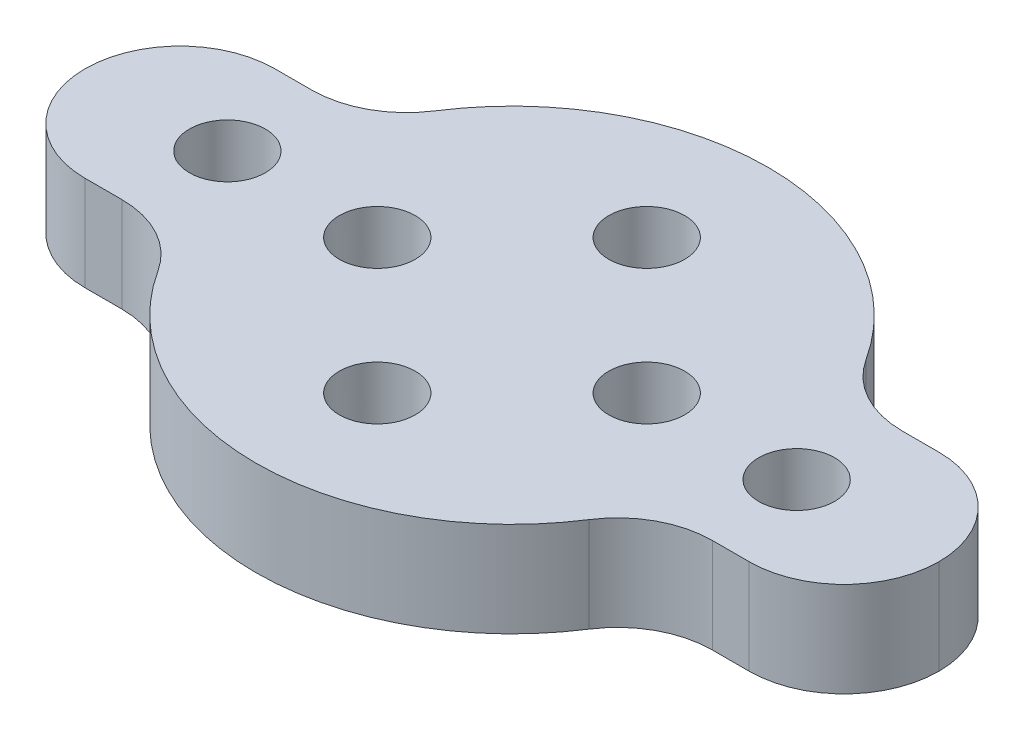
ISO-10303-21;
HEADER;
FILE_DESCRIPTION(('STEP AP214'),'2;1');
FILE_NAME('part.step','',(''),(''),'','','');
FILE_SCHEMA(('AUTOMOTIVE_DESIGN { 1 0 10303 214 1 1 1 1 }'));
ENDSEC;
DATA;
#1=APPLICATION_CONTEXT('core data for automotive mechanical design processes');
#2=APPLICATION_PROTOCOL_DEFINITION('international standard','automotive_design',2000,#1);
#3=PRODUCT_CONTEXT('',#1,'mechanical');
#4=PRODUCT('Part','Part','',(#3));
#5=PRODUCT_RELATED_PRODUCT_CATEGORY('part','',(#4));
#6=PRODUCT_DEFINITION_FORMATION('','',#4);
#7=PRODUCT_DEFINITION_CONTEXT('part definition',#1,'design');
#8=PRODUCT_DEFINITION('design','',#6,#7);
#9=PRODUCT_DEFINITION_SHAPE('','',#8);
#10=(LENGTH_UNIT() NAMED_UNIT(*) SI_UNIT(.MILLI.,.METRE.));
#11=(NAMED_UNIT(*) PLANE_ANGLE_UNIT() SI_UNIT($,.RADIAN.));
#12=(NAMED_UNIT(*) SI_UNIT($,.STERADIAN.) SOLID_ANGLE_UNIT());
#13=UNCERTAINTY_MEASURE_WITH_UNIT(LENGTH_MEASURE(1.E-05),#10,'distance_accuracy_value','');
#14=(GEOMETRIC_REPRESENTATION_CONTEXT(3) GLOBAL_UNCERTAINTY_ASSIGNED_CONTEXT((#13)) GLOBAL_UNIT_ASSIGNED_CONTEXT((#10,
#11,#12)) REPRESENTATION_CONTEXT('',''));
#15=CARTESIAN_POINT('',(0.,0.,0.));
#16=DIRECTION('',(0.,0.,1.));
#17=DIRECTION('',(1.,0.,0.));
#18=AXIS2_PLACEMENT_3D('',#15,#16,#17);
#19=CARTESIAN_POINT('',(0.,5.,-7.10000000000007));
#20=DIRECTION('',(0.,-1.,0.));
#21=DIRECTION('',(0.,0.,-1.));
#22=AXIS2_PLACEMENT_3D('',#19,#20,#21);
#23=CYLINDRICAL_SURFACE('',#22,1.99999999999993);
#24=CARTESIAN_POINT('',(0.,5.,-7.10000000000007));
#25=DIRECTION('',(0.,1.,0.));
#26=DIRECTION('',(0.,0.,1.));
#27=AXIS2_PLACEMENT_3D('',#24,#25,#26);
#28=CIRCLE('',#27,1.99999999999993);
#29=CARTESIAN_POINT('',(0.,5.,-5.10000000000015));
#30=VERTEX_POINT('',#29);
#31=EDGE_CURVE('E287',#30,#30,#28,.T.);
#32=ORIENTED_EDGE('',*,*,#31,.T.);
#33=EDGE_LOOP('',(#32));
#34=FACE_BOUND('',#33,.T.);
#35=CARTESIAN_POINT('',(0.,2.,-7.10000000000007));
#36=DIRECTION('',(0.,-1.,0.));
#37=DIRECTION('',(0.,0.,-1.));
#38=AXIS2_PLACEMENT_3D('',#35,#36,#37);
#39=CIRCLE('',#38,1.99999999999993);
#40=CARTESIAN_POINT('',(0.,2.,-9.1));
#41=VERTEX_POINT('',#40);
#42=EDGE_CURVE('E38',#41,#41,#39,.T.);
#43=ORIENTED_EDGE('',*,*,#42,.T.);
#44=EDGE_LOOP('',(#43));
#45=FACE_BOUND('',#44,.T.);
#46=ADVANCED_FACE('F34',(#34,#45),#23,.F.);
#47=CARTESIAN_POINT('',(0.,5.,7.09999999999993));
#48=DIRECTION('',(0.,-1.,0.));
#49=DIRECTION('',(0.,0.,-1.));
#50=AXIS2_PLACEMENT_3D('',#47,#48,#49);
#51=CYLINDRICAL_SURFACE('',#50,2.00000000000008);
#52=CARTESIAN_POINT('',(0.,5.,7.09999999999993));
#53=DIRECTION('',(0.,1.,0.));
#54=DIRECTION('',(0.,0.,1.));
#55=AXIS2_PLACEMENT_3D('',#52,#53,#54);
#56=CIRCLE('',#55,2.00000000000008);
#57=CARTESIAN_POINT('',(0.,5.,9.10000000000001));
#58=VERTEX_POINT('',#57);
#59=EDGE_CURVE('E290',#58,#58,#56,.T.);
#60=ORIENTED_EDGE('',*,*,#59,.T.);
#61=EDGE_LOOP('',(#60));
#62=FACE_BOUND('',#61,.T.);
#63=CARTESIAN_POINT('',(0.,2.,7.09999999999993));
#64=DIRECTION('',(0.,-1.,0.));
#65=DIRECTION('',(0.,0.,-1.));
#66=AXIS2_PLACEMENT_3D('',#63,#64,#65);
#67=CIRCLE('',#66,2.00000000000008);
#68=CARTESIAN_POINT('',(0.,2.,5.09999999999984));
#69=VERTEX_POINT('',#68);
#70=EDGE_CURVE('E230',#69,#69,#67,.T.);
#71=ORIENTED_EDGE('',*,*,#70,.T.);
#72=EDGE_LOOP('',(#71));
#73=FACE_BOUND('',#72,.T.);
#74=ADVANCED_FACE('F339',(#62,#73),#51,.F.);
#75=CARTESIAN_POINT('',(-7.1,5.,0.));
#76=DIRECTION('',(0.,-1.,0.));
#77=DIRECTION('',(0.,0.,-1.));
#78=AXIS2_PLACEMENT_3D('',#75,#76,#77);
#79=CYLINDRICAL_SURFACE('',#78,2.);
#80=CARTESIAN_POINT('',(-7.1,5.,0.));
#81=DIRECTION('',(0.,1.,0.));
#82=DIRECTION('',(0.,0.,1.));
#83=AXIS2_PLACEMENT_3D('',#80,#81,#82);
#84=CIRCLE('',#83,2.);
#85=CARTESIAN_POINT('',(-7.1,5.,2.));
#86=VERTEX_POINT('',#85);
#87=EDGE_CURVE('E271',#86,#86,#84,.T.);
#88=ORIENTED_EDGE('',*,*,#87,.T.);
#89=EDGE_LOOP('',(#88));
#90=FACE_BOUND('',#89,.T.);
#91=CARTESIAN_POINT('',(-7.1,2.,0.));
#92=DIRECTION('',(0.,-1.,0.));
#93=DIRECTION('',(0.,0.,-1.));
#94=AXIS2_PLACEMENT_3D('',#91,#92,#93);
#95=CIRCLE('',#94,2.);
#96=CARTESIAN_POINT('',(-7.1,2.,-2.));
#97=VERTEX_POINT('',#96);
#98=EDGE_CURVE('E194',#97,#97,#95,.T.);
#99=ORIENTED_EDGE('',*,*,#98,.T.);
#100=EDGE_LOOP('',(#99));
#101=FACE_BOUND('',#100,.T.);
#102=ADVANCED_FACE('F345',(#90,#101),#79,.F.);
#103=CARTESIAN_POINT('',(7.1,5.,0.));
#104=DIRECTION('',(0.,-1.,0.));
#105=DIRECTION('',(0.,0.,-1.));
#106=AXIS2_PLACEMENT_3D('',#103,#104,#105);
#107=CYLINDRICAL_SURFACE('',#106,2.);
#108=CARTESIAN_POINT('',(7.1,5.,0.));
#109=DIRECTION('',(0.,1.,0.));
#110=DIRECTION('',(0.,0.,1.));
#111=AXIS2_PLACEMENT_3D('',#108,#109,#110);
#112=CIRCLE('',#111,2.);
#113=CARTESIAN_POINT('',(7.1,5.,2.));
#114=VERTEX_POINT('',#113);
#115=EDGE_CURVE('E268',#114,#114,#112,.T.);
#116=ORIENTED_EDGE('',*,*,#115,.T.);
#117=EDGE_LOOP('',(#116));
#118=FACE_BOUND('',#117,.T.);
#119=CARTESIAN_POINT('',(7.1,2.,0.));
#120=DIRECTION('',(0.,-1.,0.));
#121=DIRECTION('',(0.,0.,-1.));
#122=AXIS2_PLACEMENT_3D('',#119,#120,#121);
#123=CIRCLE('',#122,2.);
#124=CARTESIAN_POINT('',(7.1,2.,-2.));
#125=VERTEX_POINT('',#124);
#126=EDGE_CURVE('E225',#125,#125,#123,.T.);
#127=ORIENTED_EDGE('',*,*,#126,.T.);
#128=EDGE_LOOP('',(#127));
#129=FACE_BOUND('',#128,.T.);
#130=ADVANCED_FACE('F370',(#118,#129),#107,.F.);
#131=CARTESIAN_POINT('',(0.,5.,5.));
#132=DIRECTION('',(0.,0.,-1.));
#133=DIRECTION('',(-1.,0.,0.));
#134=AXIS2_PLACEMENT_3D('',#131,#132,#133);
#135=PLANE('',#134);
#136=DIRECTION('',(1.,0.,0.));
#137=VECTOR('',#136,1.);
#138=CARTESIAN_POINT('',(0.,0.,5.));
#139=LINE('',#138,#137);
#140=CARTESIAN_POINT('',(-17.5,0.,5.));
#141=VERTEX_POINT('',#140);
#142=CARTESIAN_POINT('',(-15.5643824162734,0.,5.));
#143=VERTEX_POINT('',#142);
#144=EDGE_CURVE('E140',#141,#143,#139,.T.);
#145=ORIENTED_EDGE('',*,*,#144,.T.);
#146=DIRECTION('',(0.,1.,0.));
#147=VECTOR('',#146,1.);
#148=CARTESIAN_POINT('',(-15.5643824162734,5.,5.));
#149=LINE('',#148,#147);
#150=CARTESIAN_POINT('',(-15.5643824162734,5.,5.));
#151=VERTEX_POINT('',#150);
#152=EDGE_CURVE('E209',#143,#151,#149,.T.);
#153=ORIENTED_EDGE('',*,*,#152,.T.);
#154=DIRECTION('',(1.,0.,0.));
#155=VECTOR('',#154,1.);
#156=CARTESIAN_POINT('',(0.,5.,5.));
#157=LINE('',#156,#155);
#158=CARTESIAN_POINT('',(-17.5,5.,5.));
#159=VERTEX_POINT('',#158);
#160=EDGE_CURVE('E143',#159,#151,#157,.T.);
#161=ORIENTED_EDGE('',*,*,#160,.F.);
#162=DIRECTION('',(0.,-1.,0.));
#163=VECTOR('',#162,1.);
#164=CARTESIAN_POINT('',(-17.5,0.,5.));
#165=LINE('',#164,#163);
#166=EDGE_CURVE('E137',#159,#141,#165,.T.);
#167=ORIENTED_EDGE('',*,*,#166,.T.);
#168=EDGE_LOOP('',(#145,#153,#161,#167));
#169=FACE_BOUND('',#168,.T.);
#170=ADVANCED_FACE('F139',(#169),#135,.F.);
#171=CARTESIAN_POINT('',(0.,5.,0.));
#172=DIRECTION('',(0.,-1.,0.));
#173=DIRECTION('',(0.,0.,-1.));
#174=AXIS2_PLACEMENT_3D('',#171,#172,#173);
#175=CYLINDRICAL_SURFACE('',#174,13.5);
#176=CARTESIAN_POINT('',(0.,5.,0.));
#177=DIRECTION('',(0.,1.,0.));
#178=DIRECTION('',(0.,0.,1.));
#179=AXIS2_PLACEMENT_3D('',#176,#177,#178);
#180=CIRCLE('',#179,13.5);
#181=CARTESIAN_POINT('',(-11.3577925740373,5.,7.2972972972973));
#182=VERTEX_POINT('',#181);
#183=CARTESIAN_POINT('',(11.3577925740373,5.,7.2972972972973));
#184=VERTEX_POINT('',#183);
#185=EDGE_CURVE('E275',#182,#184,#180,.T.);
#186=ORIENTED_EDGE('',*,*,#185,.F.);
#187=DIRECTION('',(0.,-1.,0.));
#188=VECTOR('',#187,1.);
#189=CARTESIAN_POINT('',(-11.3577925740373,5.,7.2972972972973));
#190=LINE('',#189,#188);
#191=CARTESIAN_POINT('',(-11.3577925740373,0.,7.2972972972973));
#192=VERTEX_POINT('',#191);
#193=EDGE_CURVE('E206',#182,#192,#190,.T.);
#194=ORIENTED_EDGE('',*,*,#193,.T.);
#195=CARTESIAN_POINT('',(0.,0.,0.));
#196=DIRECTION('',(0.,1.,0.));
#197=DIRECTION('',(0.,0.,1.));
#198=AXIS2_PLACEMENT_3D('',#195,#196,#197);
#199=CIRCLE('',#198,13.5);
#200=CARTESIAN_POINT('',(11.3577925740373,0.,7.2972972972973));
#201=VERTEX_POINT('',#200);
#202=EDGE_CURVE('E156',#192,#201,#199,.T.);
#203=ORIENTED_EDGE('',*,*,#202,.T.);
#204=DIRECTION('',(0.,-1.,0.));
#205=VECTOR('',#204,1.);
#206=CARTESIAN_POINT('',(11.3577925740373,5.,7.2972972972973));
#207=LINE('',#206,#205);
#208=EDGE_CURVE('E204',#201,#184,#207,.F.);
#209=ORIENTED_EDGE('',*,*,#208,.T.);
#210=EDGE_LOOP('',(#186,#194,#203,#209));
#211=FACE_BOUND('',#210,.T.);
#212=ADVANCED_FACE('F324',(#211),#175,.T.);
#213=CARTESIAN_POINT('',(0.,5.,5.));
#214=DIRECTION('',(0.,0.,-1.));
#215=DIRECTION('',(-1.,0.,0.));
#216=AXIS2_PLACEMENT_3D('',#213,#214,#215);
#217=PLANE('',#216);
#218=DIRECTION('',(1.,0.,0.));
#219=VECTOR('',#218,1.);
#220=CARTESIAN_POINT('',(0.,5.,5.));
#221=LINE('',#220,#219);
#222=CARTESIAN_POINT('',(15.5643824162734,5.,5.));
#223=VERTEX_POINT('',#222);
#224=CARTESIAN_POINT('',(17.5,5.,5.));
#225=VERTEX_POINT('',#224);
#226=EDGE_CURVE('E277',#223,#225,#221,.T.);
#227=ORIENTED_EDGE('',*,*,#226,.F.);
#228=DIRECTION('',(0.,1.,0.));
#229=VECTOR('',#228,1.);
#230=CARTESIAN_POINT('',(15.5643824162734,0.,5.));
#231=LINE('',#230,#229);
#232=CARTESIAN_POINT('',(15.5643824162734,0.,5.));
#233=VERTEX_POINT('',#232);
#234=EDGE_CURVE('E211',#223,#233,#231,.F.);
#235=ORIENTED_EDGE('',*,*,#234,.T.);
#236=DIRECTION('',(1.,0.,0.));
#237=VECTOR('',#236,1.);
#238=CARTESIAN_POINT('',(0.,0.,5.));
#239=LINE('',#238,#237);
#240=CARTESIAN_POINT('',(17.5,0.,5.));
#241=VERTEX_POINT('',#240);
#242=EDGE_CURVE('E299',#233,#241,#239,.T.);
#243=ORIENTED_EDGE('',*,*,#242,.T.);
#244=DIRECTION('',(0.,-1.,0.));
#245=VECTOR('',#244,1.);
#246=CARTESIAN_POINT('',(17.5,5.,5.));
#247=LINE('',#246,#245);
#248=EDGE_CURVE('E147',#241,#225,#247,.F.);
#249=ORIENTED_EDGE('',*,*,#248,.T.);
#250=EDGE_LOOP('',(#227,#235,#243,#249));
#251=FACE_BOUND('',#250,.T.);
#252=ADVANCED_FACE('F321',(#251),#217,.F.);
#253=CARTESIAN_POINT('',(0.,5.,-5.));
#254=DIRECTION('',(0.,0.,-1.));
#255=DIRECTION('',(-1.,0.,0.));
#256=AXIS2_PLACEMENT_3D('',#253,#254,#255);
#257=PLANE('',#256);
#258=DIRECTION('',(1.,0.,0.));
#259=VECTOR('',#258,1.);
#260=CARTESIAN_POINT('',(0.,0.,-5.));
#261=LINE('',#260,#259);
#262=CARTESIAN_POINT('',(15.5643824162734,0.,-5.));
#263=VERTEX_POINT('',#262);
#264=CARTESIAN_POINT('',(17.5,0.,-5.));
#265=VERTEX_POINT('',#264);
#266=EDGE_CURVE('E301',#263,#265,#261,.T.);
#267=ORIENTED_EDGE('',*,*,#266,.F.);
#268=DIRECTION('',(0.,-1.,0.));
#269=VECTOR('',#268,1.);
#270=CARTESIAN_POINT('',(15.5643824162734,5.,-5.));
#271=LINE('',#270,#269);
#272=CARTESIAN_POINT('',(15.5643824162734,5.,-5.));
#273=VERTEX_POINT('',#272);
#274=EDGE_CURVE('E199',#263,#273,#271,.F.);
#275=ORIENTED_EDGE('',*,*,#274,.T.);
#276=DIRECTION('',(1.,0.,0.));
#277=VECTOR('',#276,1.);
#278=CARTESIAN_POINT('',(0.,5.,-5.));
#279=LINE('',#278,#277);
#280=CARTESIAN_POINT('',(17.5,5.,-5.));
#281=VERTEX_POINT('',#280);
#282=EDGE_CURVE('E279',#273,#281,#279,.T.);
#283=ORIENTED_EDGE('',*,*,#282,.T.);
#284=DIRECTION('',(0.,-1.,0.));
#285=VECTOR('',#284,1.);
#286=CARTESIAN_POINT('',(17.5,0.,-5.));
#287=LINE('',#286,#285);
#288=EDGE_CURVE('E185',#281,#265,#287,.T.);
#289=ORIENTED_EDGE('',*,*,#288,.T.);
#290=EDGE_LOOP('',(#267,#275,#283,#289));
#291=FACE_BOUND('',#290,.T.);
#292=ADVANCED_FACE('F359',(#291),#257,.T.);
#293=CARTESIAN_POINT('',(0.,5.,0.));
#294=DIRECTION('',(0.,-1.,0.));
#295=DIRECTION('',(0.,0.,-1.));
#296=AXIS2_PLACEMENT_3D('',#293,#294,#295);
#297=CYLINDRICAL_SURFACE('',#296,13.5);
#298=CARTESIAN_POINT('',(0.,5.,0.));
#299=DIRECTION('',(0.,1.,0.));
#300=DIRECTION('',(0.,0.,1.));
#301=AXIS2_PLACEMENT_3D('',#298,#299,#300);
#302=CIRCLE('',#301,13.5);
#303=CARTESIAN_POINT('',(11.3577925740373,5.,-7.2972972972973));
#304=VERTEX_POINT('',#303);
#305=CARTESIAN_POINT('',(-11.3577925740373,5.,-7.2972972972973));
#306=VERTEX_POINT('',#305);
#307=EDGE_CURVE('E281',#304,#306,#302,.T.);
#308=ORIENTED_EDGE('',*,*,#307,.F.);
#309=DIRECTION('',(0.,-1.,0.));
#310=VECTOR('',#309,1.);
#311=CARTESIAN_POINT('',(11.3577925740373,5.,-7.2972972972973));
#312=LINE('',#311,#310);
#313=CARTESIAN_POINT('',(11.3577925740373,0.,-7.2972972972973));
#314=VERTEX_POINT('',#313);
#315=EDGE_CURVE('E196',#304,#314,#312,.T.);
#316=ORIENTED_EDGE('',*,*,#315,.T.);
#317=CARTESIAN_POINT('',(0.,0.,0.));
#318=DIRECTION('',(0.,1.,0.));
#319=DIRECTION('',(0.,0.,1.));
#320=AXIS2_PLACEMENT_3D('',#317,#318,#319);
#321=CIRCLE('',#320,13.5);
#322=CARTESIAN_POINT('',(-11.3577925740373,0.,-7.2972972972973));
#323=VERTEX_POINT('',#322);
#324=EDGE_CURVE('E303',#314,#323,#321,.T.);
#325=ORIENTED_EDGE('',*,*,#324,.T.);
#326=DIRECTION('',(0.,-1.,0.));
#327=VECTOR('',#326,1.);
#328=CARTESIAN_POINT('',(-11.3577925740373,5.,-7.2972972972973));
#329=LINE('',#328,#327);
#330=EDGE_CURVE('E188',#323,#306,#329,.F.);
#331=ORIENTED_EDGE('',*,*,#330,.T.);
#332=EDGE_LOOP('',(#308,#316,#325,#331));
#333=FACE_BOUND('',#332,.T.);
#334=ADVANCED_FACE('F355',(#333),#297,.T.);
#335=CARTESIAN_POINT('',(0.,5.,-5.));
#336=DIRECTION('',(0.,0.,-1.));
#337=DIRECTION('',(-1.,0.,0.));
#338=AXIS2_PLACEMENT_3D('',#335,#336,#337);
#339=PLANE('',#338);
#340=DIRECTION('',(1.,0.,0.));
#341=VECTOR('',#340,1.);
#342=CARTESIAN_POINT('',(0.,5.,-5.));
#343=LINE('',#342,#341);
#344=CARTESIAN_POINT('',(-17.5,5.,-5.));
#345=VERTEX_POINT('',#344);
#346=CARTESIAN_POINT('',(-15.5643824162734,5.,-5.));
#347=VERTEX_POINT('',#346);
#348=EDGE_CURVE('E284',#345,#347,#343,.T.);
#349=ORIENTED_EDGE('',*,*,#348,.T.);
#350=DIRECTION('',(0.,-1.,0.));
#351=VECTOR('',#350,1.);
#352=CARTESIAN_POINT('',(-15.5643824162734,5.,-5.));
#353=LINE('',#352,#351);
#354=CARTESIAN_POINT('',(-15.5643824162734,0.,-5.));
#355=VERTEX_POINT('',#354);
#356=EDGE_CURVE('E201',#347,#355,#353,.T.);
#357=ORIENTED_EDGE('',*,*,#356,.T.);
#358=DIRECTION('',(1.,0.,0.));
#359=VECTOR('',#358,1.);
#360=CARTESIAN_POINT('',(0.,0.,-5.));
#361=LINE('',#360,#359);
#362=CARTESIAN_POINT('',(-17.5,0.,-5.));
#363=VERTEX_POINT('',#362);
#364=EDGE_CURVE('E265',#363,#355,#361,.T.);
#365=ORIENTED_EDGE('',*,*,#364,.F.);
#366=DIRECTION('',(0.,-1.,0.));
#367=VECTOR('',#366,1.);
#368=CARTESIAN_POINT('',(-17.5,5.,-5.));
#369=LINE('',#368,#367);
#370=EDGE_CURVE('E166',#363,#345,#369,.F.);
#371=ORIENTED_EDGE('',*,*,#370,.T.);
#372=EDGE_LOOP('',(#349,#357,#365,#371));
#373=FACE_BOUND('',#372,.T.);
#374=ADVANCED_FACE('F351',(#373),#339,.T.);
#375=CARTESIAN_POINT('',(-15.,5.,0.));
#376=DIRECTION('',(0.,-1.,0.));
#377=DIRECTION('',(0.,0.,-1.));
#378=AXIS2_PLACEMENT_3D('',#375,#376,#377);
#379=CYLINDRICAL_SURFACE('',#378,2.);
#380=CARTESIAN_POINT('',(-15.,5.,0.));
#381=DIRECTION('',(0.,1.,0.));
#382=DIRECTION('',(0.,0.,1.));
#383=AXIS2_PLACEMENT_3D('',#380,#381,#382);
#384=CIRCLE('',#383,2.);
#385=CARTESIAN_POINT('',(-15.,5.,2.));
#386=VERTEX_POINT('',#385);
#387=EDGE_CURVE('E264',#386,#386,#384,.T.);
#388=ORIENTED_EDGE('',*,*,#387,.T.);
#389=EDGE_LOOP('',(#388));
#390=FACE_BOUND('',#389,.T.);
#391=CARTESIAN_POINT('',(-15.,0.,0.));
#392=DIRECTION('',(0.,1.,0.));
#393=DIRECTION('',(0.,0.,1.));
#394=AXIS2_PLACEMENT_3D('',#391,#392,#393);
#395=CIRCLE('',#394,2.);
#396=CARTESIAN_POINT('',(-15.,0.,2.));
#397=VERTEX_POINT('',#396);
#398=EDGE_CURVE('E157',#397,#397,#395,.T.);
#399=ORIENTED_EDGE('',*,*,#398,.F.);
#400=EDGE_LOOP('',(#399));
#401=FACE_BOUND('',#400,.T.);
#402=ADVANCED_FACE('F354',(#390,#401),#379,.F.);
#403=CARTESIAN_POINT('',(15.,5.,0.));
#404=DIRECTION('',(0.,-1.,0.));
#405=DIRECTION('',(0.,0.,-1.));
#406=AXIS2_PLACEMENT_3D('',#403,#404,#405);
#407=CYLINDRICAL_SURFACE('',#406,2.);
#408=CARTESIAN_POINT('',(15.,5.,0.));
#409=DIRECTION('',(0.,1.,0.));
#410=DIRECTION('',(0.,0.,1.));
#411=AXIS2_PLACEMENT_3D('',#408,#409,#410);
#412=CIRCLE('',#411,2.);
#413=CARTESIAN_POINT('',(15.,5.,2.));
#414=VERTEX_POINT('',#413);
#415=EDGE_CURVE('E261',#414,#414,#412,.T.);
#416=ORIENTED_EDGE('',*,*,#415,.T.);
#417=EDGE_LOOP('',(#416));
#418=FACE_BOUND('',#417,.T.);
#419=CARTESIAN_POINT('',(15.,0.,0.));
#420=DIRECTION('',(0.,1.,0.));
#421=DIRECTION('',(0.,0.,1.));
#422=AXIS2_PLACEMENT_3D('',#419,#420,#421);
#423=CIRCLE('',#422,2.);
#424=CARTESIAN_POINT('',(15.,0.,2.));
#425=VERTEX_POINT('',#424);
#426=EDGE_CURVE('E190',#425,#425,#423,.T.);
#427=ORIENTED_EDGE('',*,*,#426,.F.);
#428=EDGE_LOOP('',(#427));
#429=FACE_BOUND('',#428,.T.);
#430=ADVANCED_FACE('F379',(#418,#429),#407,.F.);
#431=CARTESIAN_POINT('',(0.,5.,0.));
#432=DIRECTION('',(0.,1.,0.));
#433=DIRECTION('',(0.,0.,1.));
#434=AXIS2_PLACEMENT_3D('',#431,#432,#433);
#435=PLANE('',#434);
#436=ORIENTED_EDGE('',*,*,#415,.F.);
#437=EDGE_LOOP('',(#436));
#438=FACE_BOUND('',#437,.T.);
#439=ORIENTED_EDGE('',*,*,#387,.F.);
#440=EDGE_LOOP('',(#439));
#441=FACE_BOUND('',#440,.T.);
#442=ORIENTED_EDGE('',*,*,#115,.F.);
#443=EDGE_LOOP('',(#442));
#444=FACE_BOUND('',#443,.T.);
#445=ORIENTED_EDGE('',*,*,#87,.F.);
#446=EDGE_LOOP('',(#445));
#447=FACE_BOUND('',#446,.T.);
#448=ORIENTED_EDGE('',*,*,#348,.F.);
#449=CARTESIAN_POINT('',(-17.5,5.,0.));
#450=DIRECTION('',(0.,1.,0.));
#451=DIRECTION('',(0.,0.,1.));
#452=AXIS2_PLACEMENT_3D('',#449,#450,#451);
#453=CIRCLE('',#452,5.);
#454=CARTESIAN_POINT('',(-22.5,5.,0.));
#455=VERTEX_POINT('',#454);
#456=EDGE_CURVE('E148',#345,#455,#453,.T.);
#457=ORIENTED_EDGE('',*,*,#456,.T.);
#458=CARTESIAN_POINT('',(-17.5,5.,0.));
#459=DIRECTION('',(0.,1.,0.));
#460=DIRECTION('',(0.,0.,1.));
#461=AXIS2_PLACEMENT_3D('',#458,#459,#460);
#462=CIRCLE('',#461,5.);
#463=EDGE_CURVE('E180',#455,#159,#462,.T.);
#464=ORIENTED_EDGE('',*,*,#463,.T.);
#465=ORIENTED_EDGE('',*,*,#160,.T.);
#466=CARTESIAN_POINT('',(-15.5643824162734,5.,10.));
#467=DIRECTION('',(0.,1.,0.));
#468=DIRECTION('',(0.,0.,1.));
#469=AXIS2_PLACEMENT_3D('',#466,#467,#468);
#470=CIRCLE('',#469,5.);
#471=EDGE_CURVE('E222',#151,#182,#470,.F.);
#472=ORIENTED_EDGE('',*,*,#471,.T.);
#473=ORIENTED_EDGE('',*,*,#185,.T.);
#474=CARTESIAN_POINT('',(15.5643824162734,5.,10.));
#475=DIRECTION('',(0.,1.,0.));
#476=DIRECTION('',(0.,0.,1.));
#477=AXIS2_PLACEMENT_3D('',#474,#475,#476);
#478=CIRCLE('',#477,5.);
#479=EDGE_CURVE('E11',#184,#223,#478,.F.);
#480=ORIENTED_EDGE('',*,*,#479,.T.);
#481=ORIENTED_EDGE('',*,*,#226,.T.);
#482=CARTESIAN_POINT('',(17.5,5.,0.));
#483=DIRECTION('',(0.,1.,0.));
#484=DIRECTION('',(0.,0.,1.));
#485=AXIS2_PLACEMENT_3D('',#482,#483,#484);
#486=CIRCLE('',#485,5.);
#487=CARTESIAN_POINT('',(22.5,5.,0.));
#488=VERTEX_POINT('',#487);
#489=EDGE_CURVE('E178',#225,#488,#486,.T.);
#490=ORIENTED_EDGE('',*,*,#489,.T.);
#491=CARTESIAN_POINT('',(17.5,5.,0.));
#492=DIRECTION('',(0.,1.,0.));
#493=DIRECTION('',(0.,0.,1.));
#494=AXIS2_PLACEMENT_3D('',#491,#492,#493);
#495=CIRCLE('',#494,5.);
#496=EDGE_CURVE('E175',#488,#281,#495,.T.);
#497=ORIENTED_EDGE('',*,*,#496,.T.);
#498=ORIENTED_EDGE('',*,*,#282,.F.);
#499=CARTESIAN_POINT('',(15.5643824162734,5.,-10.));
#500=DIRECTION('',(0.,1.,0.));
#501=DIRECTION('',(0.,0.,1.));
#502=AXIS2_PLACEMENT_3D('',#499,#500,#501);
#503=CIRCLE('',#502,5.);
#504=EDGE_CURVE('E215',#273,#304,#503,.F.);
#505=ORIENTED_EDGE('',*,*,#504,.T.);
#506=ORIENTED_EDGE('',*,*,#307,.T.);
#507=CARTESIAN_POINT('',(-15.5643824162734,5.,-10.));
#508=DIRECTION('',(0.,1.,0.));
#509=DIRECTION('',(0.,0.,1.));
#510=AXIS2_PLACEMENT_3D('',#507,#508,#509);
#511=CIRCLE('',#510,5.);
#512=EDGE_CURVE('E219',#306,#347,#511,.F.);
#513=ORIENTED_EDGE('',*,*,#512,.T.);
#514=EDGE_LOOP('',(#448,#457,#464,#465,#472,#473,#480,#481,#490,#497,#498,#505,#506,#513));
#515=FACE_BOUND('',#514,.T.);
#516=ORIENTED_EDGE('',*,*,#31,.F.);
#517=EDGE_LOOP('',(#516));
#518=FACE_BOUND('',#517,.T.);
#519=ORIENTED_EDGE('',*,*,#59,.F.);
#520=EDGE_LOOP('',(#519));
#521=FACE_BOUND('',#520,.T.);
#522=ADVANCED_FACE('F383',(#438,#441,#444,#447,#515,#518,#521),#435,.T.);
#523=CARTESIAN_POINT('',(0.,0.,0.));
#524=DIRECTION('',(0.,1.,0.));
#525=DIRECTION('',(0.,0.,1.));
#526=AXIS2_PLACEMENT_3D('',#523,#524,#525);
#527=PLANE('',#526);
#528=CARTESIAN_POINT('',(0.,0.,7.1));
#529=DIRECTION('',(0.,-1.,0.));
#530=DIRECTION('',(-1.,0.,0.));
#531=AXIS2_PLACEMENT_3D('',#528,#529,#530);
#532=CIRCLE('',#531,3.5);
#533=CARTESIAN_POINT('',(-3.49999999999998,0.,7.10000000000001));
#534=VERTEX_POINT('',#533);
#535=EDGE_CURVE('E238',#534,#534,#532,.T.);
#536=ORIENTED_EDGE('',*,*,#535,.F.);
#537=EDGE_LOOP('',(#536));
#538=FACE_BOUND('',#537,.T.);
#539=CARTESIAN_POINT('',(0.,0.,-7.1));
#540=DIRECTION('',(0.,-1.,0.));
#541=DIRECTION('',(-1.,0.,0.));
#542=AXIS2_PLACEMENT_3D('',#539,#540,#541);
#543=CIRCLE('',#542,3.5);
#544=CARTESIAN_POINT('',(-3.50000000000003,0.,-7.09999999999999));
#545=VERTEX_POINT('',#544);
#546=EDGE_CURVE('E248',#545,#545,#543,.T.);
#547=ORIENTED_EDGE('',*,*,#546,.F.);
#548=EDGE_LOOP('',(#547));
#549=FACE_BOUND('',#548,.T.);
#550=CARTESIAN_POINT('',(-7.1,0.,0.));
#551=DIRECTION('',(0.,-1.,0.));
#552=DIRECTION('',(0.,0.,-1.));
#553=AXIS2_PLACEMENT_3D('',#550,#551,#552);
#554=CIRCLE('',#553,3.5);
#555=CARTESIAN_POINT('',(-7.1,0.,-3.5));
#556=VERTEX_POINT('',#555);
#557=EDGE_CURVE('E253',#556,#556,#554,.T.);
#558=ORIENTED_EDGE('',*,*,#557,.F.);
#559=EDGE_LOOP('',(#558));
#560=FACE_BOUND('',#559,.T.);
#561=CARTESIAN_POINT('',(7.1,0.,0.));
#562=DIRECTION('',(0.,-1.,0.));
#563=DIRECTION('',(0.,0.,-1.));
#564=AXIS2_PLACEMENT_3D('',#561,#562,#563);
#565=CIRCLE('',#564,3.5);
#566=CARTESIAN_POINT('',(7.1,0.,-3.5));
#567=VERTEX_POINT('',#566);
#568=EDGE_CURVE('E236',#567,#567,#565,.T.);
#569=ORIENTED_EDGE('',*,*,#568,.F.);
#570=EDGE_LOOP('',(#569));
#571=FACE_BOUND('',#570,.T.);
#572=ORIENTED_EDGE('',*,*,#426,.T.);
#573=EDGE_LOOP('',(#572));
#574=FACE_BOUND('',#573,.T.);
#575=ORIENTED_EDGE('',*,*,#398,.T.);
#576=EDGE_LOOP('',(#575));
#577=FACE_BOUND('',#576,.T.);
#578=CARTESIAN_POINT('',(-17.5,0.,0.));
#579=DIRECTION('',(0.,1.,0.));
#580=DIRECTION('',(0.,0.,1.));
#581=AXIS2_PLACEMENT_3D('',#578,#579,#580);
#582=CIRCLE('',#581,5.);
#583=CARTESIAN_POINT('',(-22.5,0.,0.));
#584=VERTEX_POINT('',#583);
#585=EDGE_CURVE('E152',#141,#584,#582,.F.);
#586=ORIENTED_EDGE('',*,*,#585,.T.);
#587=CARTESIAN_POINT('',(-17.5,0.,0.));
#588=DIRECTION('',(0.,1.,0.));
#589=DIRECTION('',(0.,0.,1.));
#590=AXIS2_PLACEMENT_3D('',#587,#588,#589);
#591=CIRCLE('',#590,5.);
#592=EDGE_CURVE('E163',#584,#363,#591,.F.);
#593=ORIENTED_EDGE('',*,*,#592,.T.);
#594=ORIENTED_EDGE('',*,*,#364,.T.);
#595=CARTESIAN_POINT('',(-15.5643824162734,0.,-10.));
#596=DIRECTION('',(0.,1.,0.));
#597=DIRECTION('',(0.,0.,1.));
#598=AXIS2_PLACEMENT_3D('',#595,#596,#597);
#599=CIRCLE('',#598,5.);
#600=EDGE_CURVE('E217',#355,#323,#599,.T.);
#601=ORIENTED_EDGE('',*,*,#600,.T.);
#602=ORIENTED_EDGE('',*,*,#324,.F.);
#603=CARTESIAN_POINT('',(15.5643824162734,0.,-10.));
#604=DIRECTION('',(0.,1.,0.));
#605=DIRECTION('',(0.,0.,1.));
#606=AXIS2_PLACEMENT_3D('',#603,#604,#605);
#607=CIRCLE('',#606,5.);
#608=EDGE_CURVE('E213',#314,#263,#607,.T.);
#609=ORIENTED_EDGE('',*,*,#608,.T.);
#610=ORIENTED_EDGE('',*,*,#266,.T.);
#611=CARTESIAN_POINT('',(17.5,0.,0.));
#612=DIRECTION('',(0.,1.,0.));
#613=DIRECTION('',(0.,0.,1.));
#614=AXIS2_PLACEMENT_3D('',#611,#612,#613);
#615=CIRCLE('',#614,5.);
#616=CARTESIAN_POINT('',(22.5,0.,0.));
#617=VERTEX_POINT('',#616);
#618=EDGE_CURVE('E169',#265,#617,#615,.F.);
#619=ORIENTED_EDGE('',*,*,#618,.T.);
#620=CARTESIAN_POINT('',(17.5,0.,0.));
#621=DIRECTION('',(0.,1.,0.));
#622=DIRECTION('',(0.,0.,1.));
#623=AXIS2_PLACEMENT_3D('',#620,#621,#622);
#624=CIRCLE('',#623,5.);
#625=EDGE_CURVE('E164',#617,#241,#624,.F.);
#626=ORIENTED_EDGE('',*,*,#625,.T.);
#627=ORIENTED_EDGE('',*,*,#242,.F.);
#628=CARTESIAN_POINT('',(15.5643824162734,0.,10.));
#629=DIRECTION('',(0.,1.,0.));
#630=DIRECTION('',(0.,0.,1.));
#631=AXIS2_PLACEMENT_3D('',#628,#629,#630);
#632=CIRCLE('',#631,5.);
#633=EDGE_CURVE('E43',#233,#201,#632,.T.);
#634=ORIENTED_EDGE('',*,*,#633,.T.);
#635=ORIENTED_EDGE('',*,*,#202,.F.);
#636=CARTESIAN_POINT('',(-15.5643824162734,0.,10.));
#637=DIRECTION('',(0.,1.,0.));
#638=DIRECTION('',(0.,0.,1.));
#639=AXIS2_PLACEMENT_3D('',#636,#637,#638);
#640=CIRCLE('',#639,5.);
#641=EDGE_CURVE('E155',#192,#143,#640,.T.);
#642=ORIENTED_EDGE('',*,*,#641,.T.);
#643=ORIENTED_EDGE('',*,*,#144,.F.);
#644=EDGE_LOOP('',(#586,#593,#594,#601,#602,#609,#610,#619,#626,#627,#634,#635,#642,#643));
#645=FACE_BOUND('',#644,.T.);
#646=ADVANCED_FACE('F151',(#538,#549,#560,#571,#574,#577,#645),#527,.F.);
#647=CARTESIAN_POINT('',(-17.5,5.,0.));
#648=DIRECTION('',(0.,1.,0.));
#649=DIRECTION('',(0.,0.,1.));
#650=AXIS2_PLACEMENT_3D('',#647,#648,#649);
#651=CYLINDRICAL_SURFACE('',#650,5.);
#652=ORIENTED_EDGE('',*,*,#166,.F.);
#653=ORIENTED_EDGE('',*,*,#463,.F.);
#654=DIRECTION('',(0.,-1.,0.));
#655=VECTOR('',#654,1.);
#656=CARTESIAN_POINT('',(-22.5,5.,0.));
#657=LINE('',#656,#655);
#658=EDGE_CURVE('E161',#584,#455,#657,.F.);
#659=ORIENTED_EDGE('',*,*,#658,.F.);
#660=ORIENTED_EDGE('',*,*,#585,.F.);
#661=EDGE_LOOP('',(#652,#653,#659,#660));
#662=FACE_BOUND('',#661,.T.);
#663=ADVANCED_FACE('F159',(#662),#651,.T.);
#664=CARTESIAN_POINT('',(-17.5,5.,0.));
#665=DIRECTION('',(0.,-1.,0.));
#666=DIRECTION('',(0.,0.,-1.));
#667=AXIS2_PLACEMENT_3D('',#664,#665,#666);
#668=CYLINDRICAL_SURFACE('',#667,5.);
#669=ORIENTED_EDGE('',*,*,#456,.F.);
#670=ORIENTED_EDGE('',*,*,#370,.F.);
#671=ORIENTED_EDGE('',*,*,#592,.F.);
#672=ORIENTED_EDGE('',*,*,#658,.T.);
#673=EDGE_LOOP('',(#669,#670,#671,#672));
#674=FACE_BOUND('',#673,.T.);
#675=ADVANCED_FACE('F385',(#674),#668,.T.);
#676=CARTESIAN_POINT('',(17.5,5.,0.));
#677=DIRECTION('',(0.,1.,0.));
#678=DIRECTION('',(0.,0.,1.));
#679=AXIS2_PLACEMENT_3D('',#676,#677,#678);
#680=CYLINDRICAL_SURFACE('',#679,5.);
#681=ORIENTED_EDGE('',*,*,#288,.F.);
#682=ORIENTED_EDGE('',*,*,#496,.F.);
#683=DIRECTION('',(0.,-1.,0.));
#684=VECTOR('',#683,1.);
#685=CARTESIAN_POINT('',(22.5,5.,0.));
#686=LINE('',#685,#684);
#687=EDGE_CURVE('E191',#617,#488,#686,.F.);
#688=ORIENTED_EDGE('',*,*,#687,.F.);
#689=ORIENTED_EDGE('',*,*,#618,.F.);
#690=EDGE_LOOP('',(#681,#682,#688,#689));
#691=FACE_BOUND('',#690,.T.);
#692=ADVANCED_FACE('F316',(#691),#680,.T.);
#693=CARTESIAN_POINT('',(17.5,5.,0.));
#694=DIRECTION('',(0.,-1.,0.));
#695=DIRECTION('',(0.,0.,-1.));
#696=AXIS2_PLACEMENT_3D('',#693,#694,#695);
#697=CYLINDRICAL_SURFACE('',#696,5.);
#698=ORIENTED_EDGE('',*,*,#489,.F.);
#699=ORIENTED_EDGE('',*,*,#248,.F.);
#700=ORIENTED_EDGE('',*,*,#625,.F.);
#701=ORIENTED_EDGE('',*,*,#687,.T.);
#702=EDGE_LOOP('',(#698,#699,#700,#701));
#703=FACE_BOUND('',#702,.T.);
#704=ADVANCED_FACE('F319',(#703),#697,.T.);
#705=CARTESIAN_POINT('',(15.5643824162734,5.,-10.));
#706=DIRECTION('',(0.,-1.,0.));
#707=DIRECTION('',(0.,0.,-1.));
#708=AXIS2_PLACEMENT_3D('',#705,#706,#707);
#709=CYLINDRICAL_SURFACE('',#708,5.);
#710=ORIENTED_EDGE('',*,*,#504,.F.);
#711=ORIENTED_EDGE('',*,*,#274,.F.);
#712=ORIENTED_EDGE('',*,*,#608,.F.);
#713=ORIENTED_EDGE('',*,*,#315,.F.);
#714=EDGE_LOOP('',(#710,#711,#712,#713));
#715=FACE_BOUND('',#714,.T.);
#716=ADVANCED_FACE('F393',(#715),#709,.F.);
#717=CARTESIAN_POINT('',(-15.5643824162734,5.,-10.));
#718=DIRECTION('',(0.,-1.,0.));
#719=DIRECTION('',(0.,0.,-1.));
#720=AXIS2_PLACEMENT_3D('',#717,#718,#719);
#721=CYLINDRICAL_SURFACE('',#720,5.);
#722=ORIENTED_EDGE('',*,*,#512,.F.);
#723=ORIENTED_EDGE('',*,*,#330,.F.);
#724=ORIENTED_EDGE('',*,*,#600,.F.);
#725=ORIENTED_EDGE('',*,*,#356,.F.);
#726=EDGE_LOOP('',(#722,#723,#724,#725));
#727=FACE_BOUND('',#726,.T.);
#728=ADVANCED_FACE('F336',(#727),#721,.F.);
#729=CARTESIAN_POINT('',(-15.5643824162734,5.,10.));
#730=DIRECTION('',(0.,-1.,0.));
#731=DIRECTION('',(0.,0.,-1.));
#732=AXIS2_PLACEMENT_3D('',#729,#730,#731);
#733=CYLINDRICAL_SURFACE('',#732,5.);
#734=ORIENTED_EDGE('',*,*,#471,.F.);
#735=ORIENTED_EDGE('',*,*,#152,.F.);
#736=ORIENTED_EDGE('',*,*,#641,.F.);
#737=ORIENTED_EDGE('',*,*,#193,.F.);
#738=EDGE_LOOP('',(#734,#735,#736,#737));
#739=FACE_BOUND('',#738,.T.);
#740=ADVANCED_FACE('F328',(#739),#733,.F.);
#741=CARTESIAN_POINT('',(15.5643824162734,5.,10.));
#742=DIRECTION('',(0.,-1.,0.));
#743=DIRECTION('',(0.,0.,-1.));
#744=AXIS2_PLACEMENT_3D('',#741,#742,#743);
#745=CYLINDRICAL_SURFACE('',#744,5.);
#746=ORIENTED_EDGE('',*,*,#479,.F.);
#747=ORIENTED_EDGE('',*,*,#208,.F.);
#748=ORIENTED_EDGE('',*,*,#633,.F.);
#749=ORIENTED_EDGE('',*,*,#234,.F.);
#750=EDGE_LOOP('',(#746,#747,#748,#749));
#751=FACE_BOUND('',#750,.T.);
#752=ADVANCED_FACE('F36',(#751),#745,.F.);
#753=CARTESIAN_POINT('',(7.1,2.,0.));
#754=DIRECTION('',(0.,-1.,0.));
#755=DIRECTION('',(0.,0.,-1.));
#756=AXIS2_PLACEMENT_3D('',#753,#754,#755);
#757=CYLINDRICAL_SURFACE('',#756,3.5);
#758=CARTESIAN_POINT('',(7.1,2.,0.));
#759=DIRECTION('',(0.,-1.,0.));
#760=DIRECTION('',(0.,0.,-1.));
#761=AXIS2_PLACEMENT_3D('',#758,#759,#760);
#762=CIRCLE('',#761,3.5);
#763=CARTESIAN_POINT('',(7.1,2.,-3.5));
#764=VERTEX_POINT('',#763);
#765=EDGE_CURVE('E256',#764,#764,#762,.T.);
#766=ORIENTED_EDGE('',*,*,#765,.F.);
#767=EDGE_LOOP('',(#766));
#768=FACE_BOUND('',#767,.T.);
#769=ORIENTED_EDGE('',*,*,#568,.T.);
#770=EDGE_LOOP('',(#769));
#771=FACE_BOUND('',#770,.T.);
#772=ADVANCED_FACE('F327',(#768,#771),#757,.F.);
#773=CARTESIAN_POINT('',(7.1,2.,0.));
#774=DIRECTION('',(0.,-1.,0.));
#775=DIRECTION('',(0.,0.,-1.));
#776=AXIS2_PLACEMENT_3D('',#773,#774,#775);
#777=PLANE('',#776);
#778=ORIENTED_EDGE('',*,*,#126,.F.);
#779=EDGE_LOOP('',(#778));
#780=FACE_BOUND('',#779,.T.);
#781=ORIENTED_EDGE('',*,*,#765,.T.);
#782=EDGE_LOOP('',(#781));
#783=FACE_BOUND('',#782,.T.);
#784=ADVANCED_FACE('F333',(#780,#783),#777,.T.);
#785=CARTESIAN_POINT('',(-7.1,2.,0.));
#786=DIRECTION('',(0.,-1.,0.));
#787=DIRECTION('',(0.,0.,-1.));
#788=AXIS2_PLACEMENT_3D('',#785,#786,#787);
#789=CYLINDRICAL_SURFACE('',#788,3.5);
#790=CARTESIAN_POINT('',(-7.1,2.,0.));
#791=DIRECTION('',(0.,-1.,0.));
#792=DIRECTION('',(0.,0.,-1.));
#793=AXIS2_PLACEMENT_3D('',#790,#791,#792);
#794=CIRCLE('',#793,3.5);
#795=CARTESIAN_POINT('',(-7.1,2.,-3.5));
#796=VERTEX_POINT('',#795);
#797=EDGE_CURVE('E228',#796,#796,#794,.T.);
#798=ORIENTED_EDGE('',*,*,#797,.F.);
#799=EDGE_LOOP('',(#798));
#800=FACE_BOUND('',#799,.T.);
#801=ORIENTED_EDGE('',*,*,#557,.T.);
#802=EDGE_LOOP('',(#801));
#803=FACE_BOUND('',#802,.T.);
#804=ADVANCED_FACE('F432',(#800,#803),#789,.F.);
#805=CARTESIAN_POINT('',(-7.1,2.,0.));
#806=DIRECTION('',(0.,-1.,0.));
#807=DIRECTION('',(0.,0.,-1.));
#808=AXIS2_PLACEMENT_3D('',#805,#806,#807);
#809=PLANE('',#808);
#810=ORIENTED_EDGE('',*,*,#98,.F.);
#811=EDGE_LOOP('',(#810));
#812=FACE_BOUND('',#811,.T.);
#813=ORIENTED_EDGE('',*,*,#797,.T.);
#814=EDGE_LOOP('',(#813));
#815=FACE_BOUND('',#814,.T.);
#816=ADVANCED_FACE('F436',(#812,#815),#809,.T.);
#817=CARTESIAN_POINT('',(0.,2.,-7.1));
#818=DIRECTION('',(0.,-1.,0.));
#819=DIRECTION('',(0.,0.,-1.));
#820=AXIS2_PLACEMENT_3D('',#817,#818,#819);
#821=CYLINDRICAL_SURFACE('',#820,3.5);
#822=CARTESIAN_POINT('',(0.,2.,-7.1));
#823=DIRECTION('',(0.,-1.,0.));
#824=DIRECTION('',(-1.,0.,0.));
#825=AXIS2_PLACEMENT_3D('',#822,#823,#824);
#826=CIRCLE('',#825,3.5);
#827=CARTESIAN_POINT('',(-3.50000000000003,2.,-7.09999999999999));
#828=VERTEX_POINT('',#827);
#829=EDGE_CURVE('E243',#828,#828,#826,.T.);
#830=ORIENTED_EDGE('',*,*,#829,.F.);
#831=EDGE_LOOP('',(#830));
#832=FACE_BOUND('',#831,.T.);
#833=ORIENTED_EDGE('',*,*,#546,.T.);
#834=EDGE_LOOP('',(#833));
#835=FACE_BOUND('',#834,.T.);
#836=ADVANCED_FACE('F440',(#832,#835),#821,.F.);
#837=CARTESIAN_POINT('',(0.,2.,-7.1));
#838=DIRECTION('',(0.,-1.,0.));
#839=DIRECTION('',(-1.,0.,0.));
#840=AXIS2_PLACEMENT_3D('',#837,#838,#839);
#841=PLANE('',#840);
#842=ORIENTED_EDGE('',*,*,#42,.F.);
#843=EDGE_LOOP('',(#842));
#844=FACE_BOUND('',#843,.T.);
#845=ORIENTED_EDGE('',*,*,#829,.T.);
#846=EDGE_LOOP('',(#845));
#847=FACE_BOUND('',#846,.T.);
#848=ADVANCED_FACE('F444',(#844,#847),#841,.T.);
#849=CARTESIAN_POINT('',(0.,2.,7.1));
#850=DIRECTION('',(0.,-1.,0.));
#851=DIRECTION('',(0.,0.,-1.));
#852=AXIS2_PLACEMENT_3D('',#849,#850,#851);
#853=CYLINDRICAL_SURFACE('',#852,3.5);
#854=CARTESIAN_POINT('',(0.,2.,7.1));
#855=DIRECTION('',(0.,-1.,0.));
#856=DIRECTION('',(-1.,0.,0.));
#857=AXIS2_PLACEMENT_3D('',#854,#855,#856);
#858=CIRCLE('',#857,3.5);
#859=CARTESIAN_POINT('',(-3.49999999999998,2.,7.10000000000001));
#860=VERTEX_POINT('',#859);
#861=EDGE_CURVE('E232',#860,#860,#858,.T.);
#862=ORIENTED_EDGE('',*,*,#861,.F.);
#863=EDGE_LOOP('',(#862));
#864=FACE_BOUND('',#863,.T.);
#865=ORIENTED_EDGE('',*,*,#535,.T.);
#866=EDGE_LOOP('',(#865));
#867=FACE_BOUND('',#866,.T.);
#868=ADVANCED_FACE('F448',(#864,#867),#853,.F.);
#869=CARTESIAN_POINT('',(0.,2.,7.1));
#870=DIRECTION('',(0.,-1.,0.));
#871=DIRECTION('',(-1.,0.,0.));
#872=AXIS2_PLACEMENT_3D('',#869,#870,#871);
#873=PLANE('',#872);
#874=ORIENTED_EDGE('',*,*,#70,.F.);
#875=EDGE_LOOP('',(#874));
#876=FACE_BOUND('',#875,.T.);
#877=ORIENTED_EDGE('',*,*,#861,.T.);
#878=EDGE_LOOP('',(#877));
#879=FACE_BOUND('',#878,.T.);
#880=ADVANCED_FACE('F452',(#876,#879),#873,.T.);
#881=CLOSED_SHELL('',(#46,#74,#102,#130,#170,#212,#252,#292,#334,#374,#402,#430,#522,#646,#663,
#675,#692,#704,#716,#728,#740,#752,#772,#784,#804,#816,#836,#848,#868,#880));
#882=MANIFOLD_SOLID_BREP('B2',#881);
#883=ADVANCED_BREP_SHAPE_REPRESENTATION('',(#18,#882),#14);
#884=SHAPE_DEFINITION_REPRESENTATION(#9,#883);
ENDSEC;
END-ISO-10303-21;
